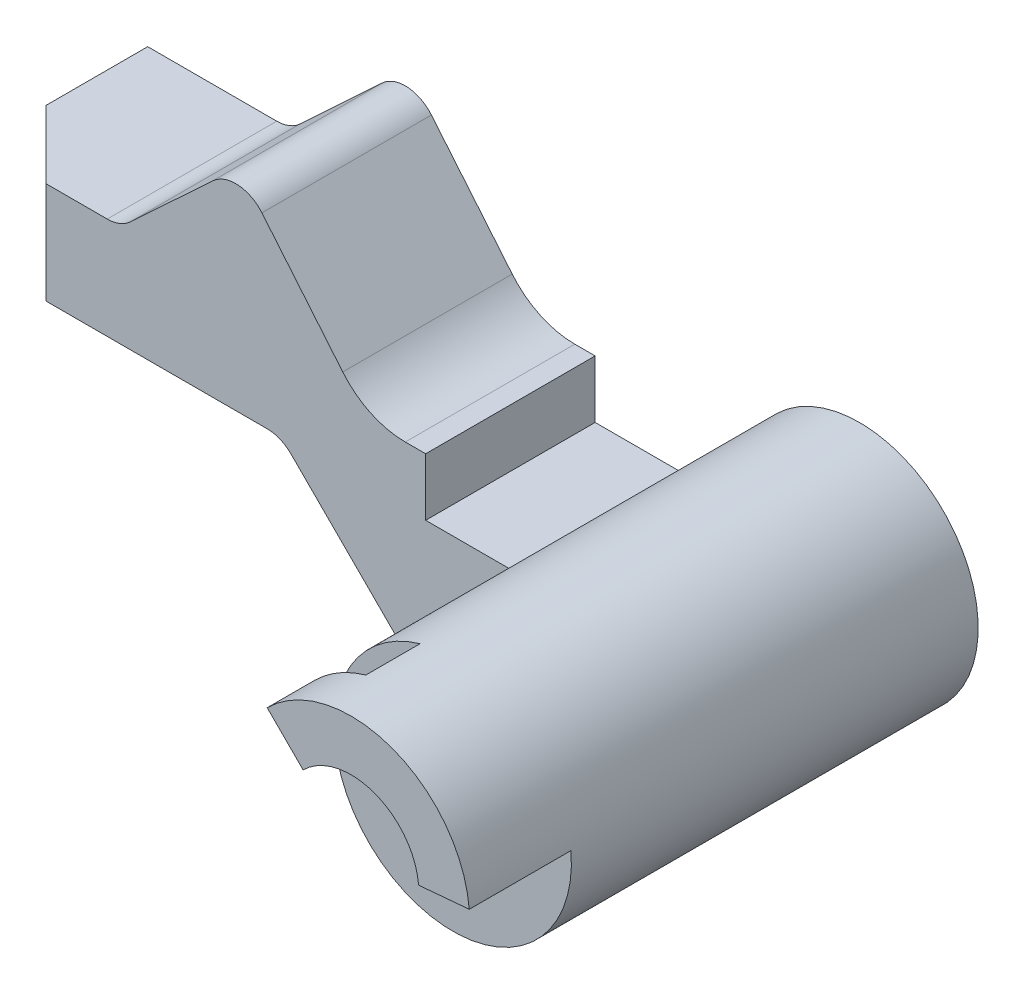
ISO-10303-21;
HEADER;
FILE_DESCRIPTION(('STEP AP214'),'2;1');
FILE_NAME('part.step','',(''),(''),'','','');
FILE_SCHEMA(('AUTOMOTIVE_DESIGN { 1 0 10303 214 1 1 1 1 }'));
ENDSEC;
DATA;
#1=APPLICATION_CONTEXT('core data for automotive mechanical design processes');
#2=APPLICATION_PROTOCOL_DEFINITION('international standard','automotive_design',2000,#1);
#3=PRODUCT_CONTEXT('',#1,'mechanical');
#4=PRODUCT('Part','Part','',(#3));
#5=PRODUCT_RELATED_PRODUCT_CATEGORY('part','',(#4));
#6=PRODUCT_DEFINITION_FORMATION('','',#4);
#7=PRODUCT_DEFINITION_CONTEXT('part definition',#1,'design');
#8=PRODUCT_DEFINITION('design','',#6,#7);
#9=PRODUCT_DEFINITION_SHAPE('','',#8);
#10=(LENGTH_UNIT() NAMED_UNIT(*) SI_UNIT(.MILLI.,.METRE.));
#11=(NAMED_UNIT(*) PLANE_ANGLE_UNIT() SI_UNIT($,.RADIAN.));
#12=(NAMED_UNIT(*) SI_UNIT($,.STERADIAN.) SOLID_ANGLE_UNIT());
#13=UNCERTAINTY_MEASURE_WITH_UNIT(LENGTH_MEASURE(1.E-05),#10,'distance_accuracy_value','');
#14=(GEOMETRIC_REPRESENTATION_CONTEXT(3) GLOBAL_UNCERTAINTY_ASSIGNED_CONTEXT((#13)) GLOBAL_UNIT_ASSIGNED_CONTEXT((#10,
#11,#12)) REPRESENTATION_CONTEXT('',''));
#15=CARTESIAN_POINT('',(0.,0.,0.));
#16=DIRECTION('',(0.,0.,1.));
#17=DIRECTION('',(1.,0.,0.));
#18=AXIS2_PLACEMENT_3D('',#15,#16,#17);
#19=CARTESIAN_POINT('',(1.012,-1.012,5.2));
#20=DIRECTION('',(0.,0.,-1.));
#21=DIRECTION('',(-1.,0.,0.));
#22=AXIS2_PLACEMENT_3D('',#19,#20,#21);
#23=PLANE('',#22);
#24=CARTESIAN_POINT('',(0.,0.,5.2));
#25=DIRECTION('',(0.,0.,-1.));
#26=DIRECTION('',(-1.,0.,0.));
#27=AXIS2_PLACEMENT_3D('',#24,#25,#26);
#28=CIRCLE('',#27,1.);
#29=CARTESIAN_POINT('',(-1.,0.,5.2));
#30=VERTEX_POINT('',#29);
#31=EDGE_CURVE('E21',#30,#30,#28,.F.);
#32=ORIENTED_EDGE('',*,*,#31,.F.);
#33=EDGE_LOOP('',(#32));
#34=FACE_BOUND('',#33,.T.);
#35=ADVANCED_FACE('F17',(#34),#23,.T.);
#36=CARTESIAN_POINT('',(0.,0.,5.67));
#37=DIRECTION('',(0.,0.,-1.));
#38=DIRECTION('',(-1.,0.,0.));
#39=AXIS2_PLACEMENT_3D('',#36,#37,#38);
#40=CYLINDRICAL_SURFACE('',#39,1.);
#41=CARTESIAN_POINT('',(0.,0.,0.5));
#42=DIRECTION('',(0.,0.,-1.));
#43=DIRECTION('',(-1.,0.,0.));
#44=AXIS2_PLACEMENT_3D('',#41,#42,#43);
#45=CIRCLE('',#44,1.);
#46=CARTESIAN_POINT('',(-1.,0.,0.5));
#47=VERTEX_POINT('',#46);
#48=EDGE_CURVE('E183',#47,#47,#45,.F.);
#49=ORIENTED_EDGE('',*,*,#48,.F.);
#50=EDGE_LOOP('',(#49));
#51=FACE_BOUND('',#50,.T.);
#52=ORIENTED_EDGE('',*,*,#31,.T.);
#53=EDGE_LOOP('',(#52));
#54=FACE_BOUND('',#53,.T.);
#55=ADVANCED_FACE('F194',(#51,#54),#40,.F.);
#56=CARTESIAN_POINT('',(0.,0.,7.65));
#57=DIRECTION('',(0.,0.,-1.));
#58=DIRECTION('',(-1.,0.,0.));
#59=AXIS2_PLACEMENT_3D('',#56,#57,#58);
#60=CYLINDRICAL_SURFACE('',#59,1.);
#61=CARTESIAN_POINT('',(0.,0.,6.8));
#62=DIRECTION('',(0.,0.,-1.));
#63=DIRECTION('',(-1.,0.,0.));
#64=AXIS2_PLACEMENT_3D('',#61,#62,#63);
#65=CIRCLE('',#64,1.);
#66=CARTESIAN_POINT('',(-0.275637355816253,0.961261695938534,6.8));
#67=VERTEX_POINT('',#66);
#68=CARTESIAN_POINT('',(-0.707106781186682,0.707106781186415,6.8));
#69=VERTEX_POINT('',#68);
#70=EDGE_CURVE('E138',#67,#69,#65,.F.);
#71=ORIENTED_EDGE('',*,*,#70,.F.);
#72=CARTESIAN_POINT('',(-0.275637355817,0.961261695938319,6.));
#73=CARTESIAN_POINT('',(-0.275637355817,0.961261695938319,6.8));
#74=B_SPLINE_CURVE_WITH_KNOTS('',1,(#72,#73),.UNSPECIFIED.,.F.,.F.,(2,2),(0.,1.),.UNSPECIFIED.);
#75=CARTESIAN_POINT('',(-0.275637355817,0.961261695938319,6.));
#76=VERTEX_POINT('',#75);
#77=EDGE_CURVE('E135',#76,#67,#74,.T.);
#78=ORIENTED_EDGE('',*,*,#77,.F.);
#79=CARTESIAN_POINT('',(0.,0.,6.));
#80=DIRECTION('',(0.,0.,-1.));
#81=DIRECTION('',(-1.,0.,0.));
#82=AXIS2_PLACEMENT_3D('',#79,#80,#81);
#83=CIRCLE('',#82,1.);
#84=CARTESIAN_POINT('',(0.996194698091745,0.0871557427476585,6.));
#85=VERTEX_POINT('',#84);
#86=EDGE_CURVE('E168',#85,#76,#83,.F.);
#87=ORIENTED_EDGE('',*,*,#86,.F.);
#88=CARTESIAN_POINT('',(0.996194698091746,0.0871557427476583,6.));
#89=CARTESIAN_POINT('',(0.996194698091746,0.0871557427476583,7.5));
#90=B_SPLINE_CURVE_WITH_KNOTS('',1,(#88,#89),.UNSPECIFIED.,.F.,.F.,(2,2),(0.,1.),.UNSPECIFIED.);
#91=CARTESIAN_POINT('',(0.996194698091745,0.0871557427476582,7.5));
#92=VERTEX_POINT('',#91);
#93=EDGE_CURVE('E178',#92,#85,#90,.F.);
#94=ORIENTED_EDGE('',*,*,#93,.F.);
#95=CARTESIAN_POINT('',(0.,0.,7.5));
#96=DIRECTION('',(0.,0.,-1.));
#97=DIRECTION('',(-1.,0.,0.));
#98=AXIS2_PLACEMENT_3D('',#95,#96,#97);
#99=CIRCLE('',#98,1.);
#100=CARTESIAN_POINT('',(-0.707106781186549,0.707106781186548,7.5));
#101=VERTEX_POINT('',#100);
#102=EDGE_CURVE('E175',#101,#92,#99,.T.);
#103=ORIENTED_EDGE('',*,*,#102,.F.);
#104=CARTESIAN_POINT('',(-0.707106781186548,0.707106781186547,6.8));
#105=CARTESIAN_POINT('',(-0.707106781186548,0.707106781186547,7.5));
#106=B_SPLINE_CURVE_WITH_KNOTS('',1,(#104,#105),.UNSPECIFIED.,.F.,.F.,(2,2),(0.,1.),.UNSPECIFIED.);
#107=EDGE_CURVE('E182',#69,#101,#106,.T.);
#108=ORIENTED_EDGE('',*,*,#107,.F.);
#109=EDGE_LOOP('',(#71,#78,#87,#94,#103,#108));
#110=FACE_BOUND('',#109,.T.);
#111=ADVANCED_FACE('F202',(#110),#60,.F.);
#112=CARTESIAN_POINT('',(0.,0.,-0.05));
#113=DIRECTION('',(0.,0.,-1.));
#114=DIRECTION('',(-1.,0.,0.));
#115=AXIS2_PLACEMENT_3D('',#112,#113,#114);
#116=CONICAL_SURFACE('',#115,1.55,0.785398163397448);
#117=CARTESIAN_POINT('',(0.,0.,0.));
#118=DIRECTION('',(0.,0.,-1.));
#119=DIRECTION('',(-1.,0.,0.));
#120=AXIS2_PLACEMENT_3D('',#117,#118,#119);
#121=CIRCLE('',#120,1.5);
#122=CARTESIAN_POINT('',(-1.5,0.,0.));
#123=VERTEX_POINT('',#122);
#124=EDGE_CURVE('E162',#123,#123,#121,.F.);
#125=ORIENTED_EDGE('',*,*,#124,.F.);
#126=EDGE_LOOP('',(#125));
#127=FACE_BOUND('',#126,.T.);
#128=ORIENTED_EDGE('',*,*,#48,.T.);
#129=EDGE_LOOP('',(#128));
#130=FACE_BOUND('',#129,.T.);
#131=ADVANCED_FACE('F759',(#127,#130),#116,.F.);
#132=CARTESIAN_POINT('',(-3.4,0.3,0.5));
#133=DIRECTION('',(1.,0.,0.));
#134=DIRECTION('',(0.,1.,0.));
#135=AXIS2_PLACEMENT_3D('',#132,#133,#134);
#136=PLANE('',#135);
#137=CARTESIAN_POINT('',(-3.4,0.3,0.5));
#138=CARTESIAN_POINT('',(-3.4,1.15,0.5));
#139=B_SPLINE_CURVE_WITH_KNOTS('',1,(#137,#138),.UNSPECIFIED.,.F.,.F.,(2,2),(0.,1.),.UNSPECIFIED.);
#140=CARTESIAN_POINT('',(-3.4,0.3,0.5));
#141=VERTEX_POINT('',#140);
#142=CARTESIAN_POINT('',(-3.4,1.15,0.5));
#143=VERTEX_POINT('',#142);
#144=EDGE_CURVE('E189',#141,#143,#139,.T.);
#145=ORIENTED_EDGE('',*,*,#144,.T.);
#146=CARTESIAN_POINT('',(-3.4,1.15,3.));
#147=CARTESIAN_POINT('',(-3.4,1.15,0.5));
#148=B_SPLINE_CURVE_WITH_KNOTS('',1,(#146,#147),.UNSPECIFIED.,.F.,.F.,(2,2),(0.,1.),.UNSPECIFIED.);
#149=CARTESIAN_POINT('',(-3.4,1.15,3.));
#150=VERTEX_POINT('',#149);
#151=EDGE_CURVE('E474',#150,#143,#148,.T.);
#152=ORIENTED_EDGE('',*,*,#151,.F.);
#153=CARTESIAN_POINT('',(-3.4,0.3,3.));
#154=CARTESIAN_POINT('',(-3.4,1.15,3.));
#155=B_SPLINE_CURVE_WITH_KNOTS('',1,(#153,#154),.UNSPECIFIED.,.F.,.F.,(2,2),(0.,1.),.UNSPECIFIED.);
#156=CARTESIAN_POINT('',(-3.4,0.3,3.));
#157=VERTEX_POINT('',#156);
#158=EDGE_CURVE('E185',#150,#157,#155,.F.);
#159=ORIENTED_EDGE('',*,*,#158,.T.);
#160=CARTESIAN_POINT('',(-3.4,0.3,0.5));
#161=CARTESIAN_POINT('',(-3.4,0.3,3.));
#162=B_SPLINE_CURVE_WITH_KNOTS('',1,(#160,#161),.UNSPECIFIED.,.F.,.F.,(2,2),(0.,1.),.UNSPECIFIED.);
#163=EDGE_CURVE('E333',#141,#157,#162,.T.);
#164=ORIENTED_EDGE('',*,*,#163,.F.);
#165=EDGE_LOOP('',(#145,#152,#159,#164));
#166=FACE_BOUND('',#165,.T.);
#167=ADVANCED_FACE('F533',(#166),#136,.T.);
#168=CARTESIAN_POINT('',(-3.3254833995939,-1.19999999999999,3.25));
#169=DIRECTION('',(0.,0.,-1.));
#170=DIRECTION('',(-1.,0.,0.));
#171=AXIS2_PLACEMENT_3D('',#168,#169,#170);
#172=CYLINDRICAL_SURFACE('',#171,0.500000000000009);
#173=CARTESIAN_POINT('',(-3.3254833995939,-1.19999999999999,0.5));
#174=DIRECTION('',(0.,0.,-1.));
#175=DIRECTION('',(-1.,0.,0.));
#176=AXIS2_PLACEMENT_3D('',#173,#174,#175);
#177=CIRCLE('',#176,0.500000000000009);
#178=CARTESIAN_POINT('',(-3.3254833995939,-1.70000000000004,0.5));
#179=VERTEX_POINT('',#178);
#180=CARTESIAN_POINT('',(-3.67903679018718,-1.55355339059327,0.5));
#181=VERTEX_POINT('',#180);
#182=EDGE_CURVE('E296',#179,#181,#177,.T.);
#183=ORIENTED_EDGE('',*,*,#182,.F.);
#184=CARTESIAN_POINT('',(-3.3254833995939,-1.7,0.5));
#185=CARTESIAN_POINT('',(-3.3254833995939,-1.7,3.));
#186=B_SPLINE_CURVE_WITH_KNOTS('',1,(#184,#185),.UNSPECIFIED.,.F.,.F.,(2,2),(0.,1.),.UNSPECIFIED.);
#187=CARTESIAN_POINT('',(-3.3254833995939,-1.7,3.));
#188=VERTEX_POINT('',#187);
#189=EDGE_CURVE('E158',#188,#179,#186,.F.);
#190=ORIENTED_EDGE('',*,*,#189,.F.);
#191=CARTESIAN_POINT('',(-3.3254833995939,-1.19999999999999,3.));
#192=DIRECTION('',(0.,0.,1.));
#193=DIRECTION('',(1.,0.,0.));
#194=AXIS2_PLACEMENT_3D('',#191,#192,#193);
#195=CIRCLE('',#194,0.500000000000009);
#196=CARTESIAN_POINT('',(-3.67903679018718,-1.55355339059327,3.));
#197=VERTEX_POINT('',#196);
#198=EDGE_CURVE('E248',#197,#188,#195,.T.);
#199=ORIENTED_EDGE('',*,*,#198,.F.);
#200=CARTESIAN_POINT('',(-3.67903679018718,-1.55355339059327,0.5));
#201=CARTESIAN_POINT('',(-3.67903679018718,-1.55355339059327,3.));
#202=B_SPLINE_CURVE_WITH_KNOTS('',1,(#200,#201),.UNSPECIFIED.,.F.,.F.,(2,2),(0.,1.),.UNSPECIFIED.);
#203=EDGE_CURVE('E251',#181,#197,#202,.T.);
#204=ORIENTED_EDGE('',*,*,#203,.F.);
#205=EDGE_LOOP('',(#183,#190,#199,#204));
#206=FACE_BOUND('',#205,.T.);
#207=ADVANCED_FACE('F250',(#206),#172,.T.);
#208=CARTESIAN_POINT('',(-3.4,0.3,0.5));
#209=DIRECTION('',(0.,1.,0.));
#210=DIRECTION('',(0.,0.,1.));
#211=AXIS2_PLACEMENT_3D('',#208,#209,#210);
#212=PLANE('',#211);
#213=ORIENTED_EDGE('',*,*,#163,.T.);
#214=CARTESIAN_POINT('',(-3.4,0.3,3.));
#215=CARTESIAN_POINT('',(-1.72409396495667,0.3,3.));
#216=B_SPLINE_CURVE_WITH_KNOTS('',1,(#214,#215),.UNSPECIFIED.,.F.,.F.,(2,2),(0.,1.),.UNSPECIFIED.);
#217=CARTESIAN_POINT('',(-1.72409396495667,0.299999999999986,3.));
#218=VERTEX_POINT('',#217);
#219=EDGE_CURVE('E336',#157,#218,#216,.T.);
#220=ORIENTED_EDGE('',*,*,#219,.T.);
#221=DIRECTION('',(0.,0.,-1.));
#222=VECTOR('',#221,1.);
#223=CARTESIAN_POINT('',(-1.72409396495667,0.299999999999971,8.25));
#224=LINE('',#223,#222);
#225=CARTESIAN_POINT('',(-1.72409396495667,0.299999999999986,0.5));
#226=VERTEX_POINT('',#225);
#227=EDGE_CURVE('E155',#226,#218,#224,.F.);
#228=ORIENTED_EDGE('',*,*,#227,.F.);
#229=CARTESIAN_POINT('',(-3.4,0.3,0.5));
#230=CARTESIAN_POINT('',(-1.72409396495667,0.3,0.5));
#231=B_SPLINE_CURVE_WITH_KNOTS('',1,(#229,#230),.UNSPECIFIED.,.F.,.F.,(2,2),(0.,1.),.UNSPECIFIED.);
#232=EDGE_CURVE('E505',#226,#141,#231,.F.);
#233=ORIENTED_EDGE('',*,*,#232,.T.);
#234=EDGE_LOOP('',(#213,#220,#228,#233));
#235=FACE_BOUND('',#234,.T.);
#236=ADVANCED_FACE('F549',(#235),#212,.T.);
#237=CARTESIAN_POINT('',(-0.482365372679749,1.68220796789206,6.));
#238=DIRECTION('',(-0.961261695938319,-0.275637355816998,0.));
#239=DIRECTION('',(0.275637355816998,-0.961261695938319,0.));
#240=AXIS2_PLACEMENT_3D('',#237,#238,#239);
#241=PLANE('',#240);
#242=DIRECTION('',(-0.275637355816999,0.961261695938319,0.));
#243=VECTOR('',#242,1.);
#244=CARTESIAN_POINT('',(-0.275637355817,0.961261695938319,6.));
#245=LINE('',#244,#243);
#246=CARTESIAN_POINT('',(-0.482365372679749,1.68220796789206,6.));
#247=VERTEX_POINT('',#246);
#248=EDGE_CURVE('E166',#76,#247,#245,.T.);
#249=ORIENTED_EDGE('',*,*,#248,.F.);
#250=ORIENTED_EDGE('',*,*,#77,.T.);
#251=DIRECTION('',(0.275637355816997,-0.96126169593832,0.));
#252=VECTOR('',#251,1.);
#253=CARTESIAN_POINT('',(-0.482365372679747,1.68220796789206,6.8));
#254=LINE('',#253,#252);
#255=CARTESIAN_POINT('',(-0.482365372679748,1.68220796789206,6.8));
#256=VERTEX_POINT('',#255);
#257=EDGE_CURVE('E129',#256,#67,#254,.T.);
#258=ORIENTED_EDGE('',*,*,#257,.F.);
#259=DIRECTION('',(0.,0.,-1.));
#260=VECTOR('',#259,1.);
#261=CARTESIAN_POINT('',(-0.482365372679749,1.68220796789206,8.25));
#262=LINE('',#261,#260);
#263=EDGE_CURVE('E134',#247,#256,#262,.F.);
#264=ORIENTED_EDGE('',*,*,#263,.F.);
#265=EDGE_LOOP('',(#249,#250,#258,#264));
#266=FACE_BOUND('',#265,.T.);
#267=ADVANCED_FACE('F132',(#266),#241,.T.);
#268=CARTESIAN_POINT('',(-1.24320766414403,0.701256174065772,6.8));
#269=DIRECTION('',(0.,0.,-1.));
#270=DIRECTION('',(0.,1.,0.));
#271=AXIS2_PLACEMENT_3D('',#268,#269,#270);
#272=PLANE('',#271);
#273=CARTESIAN_POINT('',(-1.23743686707646,1.23743686707646,6.8));
#274=CARTESIAN_POINT('',(-0.707106781186548,0.707106781186547,6.8));
#275=B_SPLINE_CURVE_WITH_KNOTS('',1,(#273,#274),.UNSPECIFIED.,.F.,.F.,(2,2),(0.,1.),.UNSPECIFIED.);
#276=CARTESIAN_POINT('',(-1.23743686707646,1.23743686707646,6.8));
#277=VERTEX_POINT('',#276);
#278=EDGE_CURVE('E144',#277,#69,#275,.T.);
#279=ORIENTED_EDGE('',*,*,#278,.F.);
#280=CARTESIAN_POINT('',(0.,0.,6.8));
#281=DIRECTION('',(0.,0.,-1.));
#282=DIRECTION('',(-1.,0.,0.));
#283=AXIS2_PLACEMENT_3D('',#280,#281,#282);
#284=CIRCLE('',#283,1.75);
#285=EDGE_CURVE('E141',#256,#277,#284,.F.);
#286=ORIENTED_EDGE('',*,*,#285,.F.);
#287=ORIENTED_EDGE('',*,*,#257,.T.);
#288=ORIENTED_EDGE('',*,*,#70,.T.);
#289=EDGE_LOOP('',(#279,#286,#287,#288));
#290=FACE_BOUND('',#289,.T.);
#291=ADVANCED_FACE('F142',(#290),#272,.T.);
#292=CARTESIAN_POINT('',(-1.23743686707646,1.23743686707646,6.8));
#293=DIRECTION('',(-0.707106781186548,-0.707106781186547,0.));
#294=DIRECTION('',(0.707106781186547,-0.707106781186548,0.));
#295=AXIS2_PLACEMENT_3D('',#292,#293,#294);
#296=PLANE('',#295);
#297=ORIENTED_EDGE('',*,*,#278,.T.);
#298=ORIENTED_EDGE('',*,*,#107,.T.);
#299=DIRECTION('',(0.707106781186549,-0.707106781186546,0.));
#300=VECTOR('',#299,1.);
#301=CARTESIAN_POINT('',(-1.23743686707646,1.23743686707646,7.5));
#302=LINE('',#301,#300);
#303=CARTESIAN_POINT('',(-1.23743686707646,1.23743686707646,7.5));
#304=VERTEX_POINT('',#303);
#305=EDGE_CURVE('E179',#304,#101,#302,.T.);
#306=ORIENTED_EDGE('',*,*,#305,.F.);
#307=DIRECTION('',(0.,0.,-1.));
#308=VECTOR('',#307,1.);
#309=CARTESIAN_POINT('',(-1.23743686707646,1.23743686707646,8.25));
#310=LINE('',#309,#308);
#311=EDGE_CURVE('E148',#277,#304,#310,.F.);
#312=ORIENTED_EDGE('',*,*,#311,.F.);
#313=EDGE_LOOP('',(#297,#298,#306,#312));
#314=FACE_BOUND('',#313,.T.);
#315=ADVANCED_FACE('F318',(#314),#296,.T.);
#316=CARTESIAN_POINT('',(1.76122538719298,0.0771786772041443,7.5));
#317=DIRECTION('',(0.,0.,1.));
#318=DIRECTION('',(0.,1.,0.));
#319=AXIS2_PLACEMENT_3D('',#316,#317,#318);
#320=PLANE('',#319);
#321=ORIENTED_EDGE('',*,*,#102,.T.);
#322=CARTESIAN_POINT('',(0.996194698091746,0.0871557427476583,7.5));
#323=CARTESIAN_POINT('',(1.74334072166055,0.152522549808402,7.5));
#324=B_SPLINE_CURVE_WITH_KNOTS('',1,(#322,#323),.UNSPECIFIED.,.F.,.F.,(2,2),(0.,1.),.UNSPECIFIED.);
#325=CARTESIAN_POINT('',(1.74334072166055,0.152522549808402,7.5));
#326=VERTEX_POINT('',#325);
#327=EDGE_CURVE('E174',#326,#92,#324,.F.);
#328=ORIENTED_EDGE('',*,*,#327,.F.);
#329=CARTESIAN_POINT('',(0.,0.,7.5));
#330=DIRECTION('',(0.,0.,-1.));
#331=DIRECTION('',(-1.,0.,0.));
#332=AXIS2_PLACEMENT_3D('',#329,#330,#331);
#333=CIRCLE('',#332,1.75);
#334=EDGE_CURVE('E314',#304,#326,#333,.T.);
#335=ORIENTED_EDGE('',*,*,#334,.F.);
#336=ORIENTED_EDGE('',*,*,#305,.T.);
#337=EDGE_LOOP('',(#321,#328,#335,#336));
#338=FACE_BOUND('',#337,.T.);
#339=ADVANCED_FACE('F321',(#338),#320,.T.);
#340=CARTESIAN_POINT('',(0.996194698091746,0.0871557427476583,6.));
#341=DIRECTION('',(0.0871557427476588,-0.996194698091745,0.));
#342=DIRECTION('',(0.996194698091745,0.0871557427476588,0.));
#343=AXIS2_PLACEMENT_3D('',#340,#341,#342);
#344=PLANE('',#343);
#345=DIRECTION('',(-0.996194698091746,-0.0871557427476595,0.));
#346=VECTOR('',#345,1.);
#347=CARTESIAN_POINT('',(1.74334072166055,0.152522549808403,6.));
#348=LINE('',#347,#346);
#349=CARTESIAN_POINT('',(1.74334072166056,0.152522549808403,6.));
#350=VERTEX_POINT('',#349);
#351=EDGE_CURVE('E171',#350,#85,#348,.T.);
#352=ORIENTED_EDGE('',*,*,#351,.F.);
#353=DIRECTION('',(0.,0.,-1.));
#354=VECTOR('',#353,1.);
#355=CARTESIAN_POINT('',(1.74334072166056,0.152522549808403,8.25));
#356=LINE('',#355,#354);
#357=EDGE_CURVE('E312',#326,#350,#356,.T.);
#358=ORIENTED_EDGE('',*,*,#357,.F.);
#359=ORIENTED_EDGE('',*,*,#327,.T.);
#360=ORIENTED_EDGE('',*,*,#93,.T.);
#361=EDGE_LOOP('',(#352,#358,#359,#360));
#362=FACE_BOUND('',#361,.T.);
#363=ADVANCED_FACE('F327',(#362),#344,.T.);
#364=CARTESIAN_POINT('',(1.80642,-1.80532719244242,6.));
#365=DIRECTION('',(0.,0.,1.));
#366=DIRECTION('',(0.,1.,0.));
#367=AXIS2_PLACEMENT_3D('',#364,#365,#366);
#368=PLANE('',#367);
#369=ORIENTED_EDGE('',*,*,#86,.T.);
#370=ORIENTED_EDGE('',*,*,#248,.T.);
#371=CARTESIAN_POINT('',(0.,0.,6.));
#372=DIRECTION('',(0.,0.,-1.));
#373=DIRECTION('',(-1.,0.,0.));
#374=AXIS2_PLACEMENT_3D('',#371,#372,#373);
#375=CIRCLE('',#374,1.75);
#376=EDGE_CURVE('E153',#350,#247,#375,.T.);
#377=ORIENTED_EDGE('',*,*,#376,.F.);
#378=ORIENTED_EDGE('',*,*,#351,.T.);
#379=EDGE_LOOP('',(#369,#370,#377,#378));
#380=FACE_BOUND('',#379,.T.);
#381=ADVANCED_FACE('F330',(#380),#368,.T.);
#382=CARTESIAN_POINT('',(1.771,-1.771,0.));
#383=DIRECTION('',(0.,0.,-1.));
#384=DIRECTION('',(-1.,0.,0.));
#385=AXIS2_PLACEMENT_3D('',#382,#383,#384);
#386=PLANE('',#385);
#387=ORIENTED_EDGE('',*,*,#124,.T.);
#388=EDGE_LOOP('',(#387));
#389=FACE_BOUND('',#388,.T.);
#390=CARTESIAN_POINT('',(0.,0.,0.));
#391=DIRECTION('',(0.,0.,-1.));
#392=DIRECTION('',(-1.,0.,0.));
#393=AXIS2_PLACEMENT_3D('',#390,#391,#392);
#394=CIRCLE('',#393,1.75);
#395=CARTESIAN_POINT('',(-1.75,0.,0.));
#396=VERTEX_POINT('',#395);
#397=EDGE_CURVE('E304',#396,#396,#394,.F.);
#398=ORIENTED_EDGE('',*,*,#397,.F.);
#399=EDGE_LOOP('',(#398));
#400=FACE_BOUND('',#399,.T.);
#401=ADVANCED_FACE('F686',(#389,#400),#386,.T.);
#402=CARTESIAN_POINT('',(-5.739696961967,-0.199999999999975,0.25));
#403=DIRECTION('',(0.,0.,1.));
#404=DIRECTION('',(1.,0.,0.));
#405=AXIS2_PLACEMENT_3D('',#402,#403,#404);
#406=CYLINDRICAL_SURFACE('',#405,0.499999999999977);
#407=CARTESIAN_POINT('',(-5.739696961967,-0.199999999999975,0.5));
#408=DIRECTION('',(0.,0.,-1.));
#409=DIRECTION('',(-1.,0.,0.));
#410=AXIS2_PLACEMENT_3D('',#407,#408,#409);
#411=CIRCLE('',#410,0.499999999999977);
#412=CARTESIAN_POINT('',(-5.38614357120451,0.153553390424055,0.5));
#413=VERTEX_POINT('',#412);
#414=CARTESIAN_POINT('',(-5.739696961967,0.300000000000002,0.5));
#415=VERTEX_POINT('',#414);
#416=EDGE_CURVE('E291',#413,#415,#411,.F.);
#417=ORIENTED_EDGE('',*,*,#416,.F.);
#418=CARTESIAN_POINT('',(-5.38614357137373,0.153553390593274,0.5));
#419=CARTESIAN_POINT('',(-5.38614357137373,0.153553390593274,3.));
#420=B_SPLINE_CURVE_WITH_KNOTS('',1,(#418,#419),.UNSPECIFIED.,.F.,.F.,(2,2),(0.,1.),.UNSPECIFIED.);
#421=CARTESIAN_POINT('',(-5.38614357137374,0.15355339059328,3.));
#422=VERTEX_POINT('',#421);
#423=EDGE_CURVE('E269',#422,#413,#420,.F.);
#424=ORIENTED_EDGE('',*,*,#423,.F.);
#425=CARTESIAN_POINT('',(-5.739696961967,-0.199999999999975,3.));
#426=DIRECTION('',(0.,0.,1.));
#427=DIRECTION('',(1.,0.,0.));
#428=AXIS2_PLACEMENT_3D('',#425,#426,#427);
#429=CIRCLE('',#428,0.499999999999977);
#430=CARTESIAN_POINT('',(-5.739696961967,0.3,3.));
#431=VERTEX_POINT('',#430);
#432=EDGE_CURVE('E272',#431,#422,#429,.F.);
#433=ORIENTED_EDGE('',*,*,#432,.F.);
#434=DIRECTION('',(0.,0.,-1.));
#435=VECTOR('',#434,1.);
#436=CARTESIAN_POINT('',(-5.739696961967,0.3,1.75));
#437=LINE('',#436,#435);
#438=EDGE_CURVE('E303',#415,#431,#437,.F.);
#439=ORIENTED_EDGE('',*,*,#438,.F.);
#440=EDGE_LOOP('',(#417,#424,#433,#439));
#441=FACE_BOUND('',#440,.T.);
#442=ADVANCED_FACE('F677',(#441),#406,.F.);
#443=CARTESIAN_POINT('',(-8.09677195262585,2.29999999999999,0.25));
#444=DIRECTION('',(0.,0.,1.));
#445=DIRECTION('',(1.,0.,0.));
#446=AXIS2_PLACEMENT_3D('',#443,#444,#445);
#447=CYLINDRICAL_SURFACE('',#446,0.499999999999996);
#448=CARTESIAN_POINT('',(-8.09677195262585,2.29999999999999,0.5));
#449=DIRECTION('',(0.,0.,-1.));
#450=DIRECTION('',(-1.,0.,0.));
#451=AXIS2_PLACEMENT_3D('',#448,#449,#450);
#452=CIRCLE('',#451,0.499999999999996);
#453=CARTESIAN_POINT('',(-8.09677195262585,1.8,0.5));
#454=VERTEX_POINT('',#453);
#455=CARTESIAN_POINT('',(-7.75600495182982,1.93410677627417,0.5));
#456=VERTEX_POINT('',#455);
#457=EDGE_CURVE('E287',#454,#456,#452,.F.);
#458=ORIENTED_EDGE('',*,*,#457,.F.);
#459=DIRECTION('',(0.,0.,1.));
#460=VECTOR('',#459,1.);
#461=CARTESIAN_POINT('',(-8.09677195262585,1.8,1.75));
#462=LINE('',#461,#460);
#463=CARTESIAN_POINT('',(-8.09677195262585,1.8,3.));
#464=VERTEX_POINT('',#463);
#465=EDGE_CURVE('E378',#464,#454,#462,.F.);
#466=ORIENTED_EDGE('',*,*,#465,.F.);
#467=CARTESIAN_POINT('',(-8.09677195262585,2.29999999999999,3.));
#468=DIRECTION('',(0.,0.,1.));
#469=DIRECTION('',(1.,0.,0.));
#470=AXIS2_PLACEMENT_3D('',#467,#468,#469);
#471=CIRCLE('',#470,0.499999999999996);
#472=CARTESIAN_POINT('',(-7.75600495113397,1.93410677692224,3.));
#473=VERTEX_POINT('',#472);
#474=EDGE_CURVE('E399',#473,#464,#471,.F.);
#475=ORIENTED_EDGE('',*,*,#474,.F.);
#476=CARTESIAN_POINT('',(-7.75600495182982,1.93410677627417,0.5));
#477=CARTESIAN_POINT('',(-7.75600495182982,1.93410677627417,3.));
#478=B_SPLINE_CURVE_WITH_KNOTS('',1,(#476,#477),.UNSPECIFIED.,.F.,.F.,(2,2),(0.,1.),.UNSPECIFIED.);
#479=EDGE_CURVE('E408',#456,#473,#478,.T.);
#480=ORIENTED_EDGE('',*,*,#479,.F.);
#481=EDGE_LOOP('',(#458,#466,#475,#480));
#482=FACE_BOUND('',#481,.T.);
#483=ADVANCED_FACE('F668',(#482),#447,.F.);
#484=CARTESIAN_POINT('',(-10.,0.3,0.5));
#485=DIRECTION('',(-1.,0.,0.));
#486=DIRECTION('',(0.,0.,1.));
#487=AXIS2_PLACEMENT_3D('',#484,#485,#486);
#488=PLANE('',#487);
#489=DIRECTION('',(0.,0.,1.));
#490=VECTOR('',#489,1.);
#491=CARTESIAN_POINT('',(-10.,0.3,1.75));
#492=LINE('',#491,#490);
#493=CARTESIAN_POINT('',(-10.,0.3,2.));
#494=VERTEX_POINT('',#493);
#495=CARTESIAN_POINT('',(-10.,0.300000000000001,0.5));
#496=VERTEX_POINT('',#495);
#497=EDGE_CURVE('E302',#494,#496,#492,.F.);
#498=ORIENTED_EDGE('',*,*,#497,.F.);
#499=CARTESIAN_POINT('',(-10.,0.3,2.));
#500=CARTESIAN_POINT('',(-10.,1.8,2.));
#501=B_SPLINE_CURVE_WITH_KNOTS('',1,(#499,#500),.UNSPECIFIED.,.F.,.F.,(2,2),(0.,1.),.UNSPECIFIED.);
#502=CARTESIAN_POINT('',(-10.,1.8,2.));
#503=VERTEX_POINT('',#502);
#504=EDGE_CURVE('E307',#503,#494,#501,.F.);
#505=ORIENTED_EDGE('',*,*,#504,.F.);
#506=DIRECTION('',(0.,0.,-1.));
#507=VECTOR('',#506,1.);
#508=CARTESIAN_POINT('',(-10.,1.8,1.75));
#509=LINE('',#508,#507);
#510=CARTESIAN_POINT('',(-10.,1.8,0.5));
#511=VERTEX_POINT('',#510);
#512=EDGE_CURVE('E384',#511,#503,#509,.F.);
#513=ORIENTED_EDGE('',*,*,#512,.F.);
#514=DIRECTION('',(0.,1.,0.));
#515=VECTOR('',#514,1.);
#516=CARTESIAN_POINT('',(-10.,0.789346999999965,0.5));
#517=LINE('',#516,#515);
#518=EDGE_CURVE('E394',#496,#511,#517,.T.);
#519=ORIENTED_EDGE('',*,*,#518,.F.);
#520=EDGE_LOOP('',(#498,#505,#513,#519));
#521=FACE_BOUND('',#520,.T.);
#522=ADVANCED_FACE('F659',(#521),#488,.T.);
#523=CARTESIAN_POINT('',(-10.,1.8,0.5));
#524=DIRECTION('',(0.,1.,0.));
#525=DIRECTION('',(0.,0.,1.));
#526=AXIS2_PLACEMENT_3D('',#523,#524,#525);
#527=PLANE('',#526);
#528=ORIENTED_EDGE('',*,*,#512,.T.);
#529=DIRECTION('',(-0.707106781186547,0.,-0.707106781186548));
#530=VECTOR('',#529,1.);
#531=CARTESIAN_POINT('',(-9.5,1.8,2.5));
#532=LINE('',#531,#530);
#533=CARTESIAN_POINT('',(-9.,1.8,3.));
#534=VERTEX_POINT('',#533);
#535=EDGE_CURVE('E370',#534,#503,#532,.T.);
#536=ORIENTED_EDGE('',*,*,#535,.F.);
#537=DIRECTION('',(-1.,0.,0.));
#538=VECTOR('',#537,1.);
#539=CARTESIAN_POINT('',(-9.04838597631293,1.8,3.));
#540=LINE('',#539,#538);
#541=EDGE_CURVE('E165',#534,#464,#540,.F.);
#542=ORIENTED_EDGE('',*,*,#541,.T.);
#543=ORIENTED_EDGE('',*,*,#465,.T.);
#544=DIRECTION('',(1.,0.,0.));
#545=VECTOR('',#544,1.);
#546=CARTESIAN_POINT('',(-5.17891159015224,1.8,0.5));
#547=LINE('',#546,#545);
#548=EDGE_CURVE('E290',#511,#454,#547,.T.);
#549=ORIENTED_EDGE('',*,*,#548,.F.);
#550=EDGE_LOOP('',(#528,#536,#542,#543,#549));
#551=FACE_BOUND('',#550,.T.);
#552=ADVANCED_FACE('F652',(#551),#527,.T.);
#553=CARTESIAN_POINT('',(-3.7,1.15,3.));
#554=DIRECTION('',(0.,1.,0.));
#555=DIRECTION('',(1.,0.,0.));
#556=AXIS2_PLACEMENT_3D('',#553,#554,#555);
#557=PLANE('',#556);
#558=CARTESIAN_POINT('',(-3.7,1.15,3.));
#559=CARTESIAN_POINT('',(-3.4,1.15,3.));
#560=B_SPLINE_CURVE_WITH_KNOTS('',1,(#558,#559),.UNSPECIFIED.,.F.,.F.,(2,2),(0.,1.),.UNSPECIFIED.);
#561=CARTESIAN_POINT('',(-3.7,1.15,3.));
#562=VERTEX_POINT('',#561);
#563=EDGE_CURVE('E377',#562,#150,#560,.T.);
#564=ORIENTED_EDGE('',*,*,#563,.T.);
#565=ORIENTED_EDGE('',*,*,#151,.T.);
#566=DIRECTION('',(1.,0.,0.));
#567=VECTOR('',#566,1.);
#568=CARTESIAN_POINT('',(-5.17891159015224,1.15,0.5));
#569=LINE('',#568,#567);
#570=CARTESIAN_POINT('',(-3.7,1.15,0.5));
#571=VERTEX_POINT('',#570);
#572=EDGE_CURVE('E284',#571,#143,#569,.T.);
#573=ORIENTED_EDGE('',*,*,#572,.F.);
#574=DIRECTION('',(0.,0.,1.));
#575=VECTOR('',#574,1.);
#576=CARTESIAN_POINT('',(-3.7,1.15,1.75));
#577=LINE('',#576,#575);
#578=EDGE_CURVE('E273',#562,#571,#577,.F.);
#579=ORIENTED_EDGE('',*,*,#578,.F.);
#580=EDGE_LOOP('',(#564,#565,#573,#579));
#581=FACE_BOUND('',#580,.T.);
#582=ADVANCED_FACE('F539',(#581),#557,.T.);
#583=CARTESIAN_POINT('',(-3.67903679018718,-1.55355339059327,0.5));
#584=DIRECTION('',(-0.707106781186546,-0.707106781186549,0.));
#585=DIRECTION('',(0.,0.,1.));
#586=AXIS2_PLACEMENT_3D('',#583,#584,#585);
#587=PLANE('',#586);
#588=ORIENTED_EDGE('',*,*,#203,.T.);
#589=DIRECTION('',(0.707106781186548,-0.707106781186547,0.));
#590=VECTOR('',#589,1.);
#591=CARTESIAN_POINT('',(-5.38614357137373,0.153553390593272,3.));
#592=LINE('',#591,#590);
#593=EDGE_CURVE('E259',#422,#197,#592,.T.);
#594=ORIENTED_EDGE('',*,*,#593,.F.);
#595=ORIENTED_EDGE('',*,*,#423,.T.);
#596=DIRECTION('',(-0.707106781186546,0.707106781186549,0.));
#597=VECTOR('',#596,1.);
#598=CARTESIAN_POINT('',(-3.67903679018718,-1.55355339059327,0.5));
#599=LINE('',#598,#597);
#600=EDGE_CURVE('E267',#181,#413,#599,.T.);
#601=ORIENTED_EDGE('',*,*,#600,.F.);
#602=EDGE_LOOP('',(#588,#594,#595,#601));
#603=FACE_BOUND('',#602,.T.);
#604=ADVANCED_FACE('F263',(#603),#587,.T.);
#605=CARTESIAN_POINT('',(-3.3254833995939,-1.7,0.5));
#606=DIRECTION('',(0.,-1.,0.));
#607=DIRECTION('',(1.,0.,0.));
#608=AXIS2_PLACEMENT_3D('',#605,#606,#607);
#609=PLANE('',#608);
#610=DIRECTION('',(-1.,0.,0.));
#611=VECTOR('',#610,1.);
#612=CARTESIAN_POINT('',(-5.17891159015224,-1.70000000000007,0.5));
#613=LINE('',#612,#611);
#614=CARTESIAN_POINT('',(-0.415331193145619,-1.70000000000007,0.5));
#615=VERTEX_POINT('',#614);
#616=EDGE_CURVE('E298',#615,#179,#613,.T.);
#617=ORIENTED_EDGE('',*,*,#616,.F.);
#618=DIRECTION('',(0.,0.,-1.));
#619=VECTOR('',#618,1.);
#620=CARTESIAN_POINT('',(-0.415331193145619,-1.70000000000007,8.25));
#621=LINE('',#620,#619);
#622=CARTESIAN_POINT('',(-0.415331193145762,-1.70000000000004,3.));
#623=VERTEX_POINT('',#622);
#624=EDGE_CURVE('E308',#623,#615,#621,.T.);
#625=ORIENTED_EDGE('',*,*,#624,.F.);
#626=DIRECTION('',(-1.,0.,0.));
#627=VECTOR('',#626,1.);
#628=CARTESIAN_POINT('',(-4.68191159015239,-1.7,3.));
#629=LINE('',#628,#627);
#630=EDGE_CURVE('E258',#188,#623,#629,.F.);
#631=ORIENTED_EDGE('',*,*,#630,.F.);
#632=ORIENTED_EDGE('',*,*,#189,.T.);
#633=EDGE_LOOP('',(#617,#625,#631,#632));
#634=FACE_BOUND('',#633,.T.);
#635=ADVANCED_FACE('F555',(#634),#609,.T.);
#636=CARTESIAN_POINT('',(0.,0.,8.25));
#637=DIRECTION('',(0.,0.,-1.));
#638=DIRECTION('',(-1.,0.,0.));
#639=AXIS2_PLACEMENT_3D('',#636,#637,#638);
#640=CYLINDRICAL_SURFACE('',#639,1.75);
#641=ORIENTED_EDGE('',*,*,#376,.T.);
#642=ORIENTED_EDGE('',*,*,#263,.T.);
#643=ORIENTED_EDGE('',*,*,#285,.T.);
#644=ORIENTED_EDGE('',*,*,#311,.T.);
#645=ORIENTED_EDGE('',*,*,#334,.T.);
#646=ORIENTED_EDGE('',*,*,#357,.T.);
#647=EDGE_LOOP('',(#641,#642,#643,#644,#645,#646));
#648=FACE_BOUND('',#647,.T.);
#649=ORIENTED_EDGE('',*,*,#397,.T.);
#650=EDGE_LOOP('',(#649));
#651=FACE_BOUND('',#650,.T.);
#652=CARTESIAN_POINT('',(0.,0.,0.5));
#653=DIRECTION('',(0.,0.,-1.));
#654=DIRECTION('',(-1.,0.,0.));
#655=AXIS2_PLACEMENT_3D('',#652,#653,#654);
#656=CIRCLE('',#655,1.75);
#657=EDGE_CURVE('E281',#226,#615,#656,.F.);
#658=ORIENTED_EDGE('',*,*,#657,.F.);
#659=ORIENTED_EDGE('',*,*,#227,.T.);
#660=CARTESIAN_POINT('',(0.,0.,3.));
#661=DIRECTION('',(0.,0.,-1.));
#662=DIRECTION('',(-1.,0.,0.));
#663=AXIS2_PLACEMENT_3D('',#660,#661,#662);
#664=CIRCLE('',#663,1.75);
#665=EDGE_CURVE('E421',#623,#218,#664,.T.);
#666=ORIENTED_EDGE('',*,*,#665,.F.);
#667=ORIENTED_EDGE('',*,*,#624,.T.);
#668=EDGE_LOOP('',(#658,#659,#666,#667));
#669=FACE_BOUND('',#668,.T.);
#670=ADVANCED_FACE('F150',(#648,#651,#669),#640,.T.);
#671=CARTESIAN_POINT('',(-9.,0.3,3.));
#672=DIRECTION('',(-0.707106781186548,0.,0.707106781186547));
#673=DIRECTION('',(0.,1.,0.));
#674=AXIS2_PLACEMENT_3D('',#671,#672,#673);
#675=PLANE('',#674);
#676=DIRECTION('',(0.,1.,0.));
#677=VECTOR('',#676,1.);
#678=CARTESIAN_POINT('',(-9.,0.789347,3.));
#679=LINE('',#678,#677);
#680=CARTESIAN_POINT('',(-9.,0.3,3.));
#681=VERTEX_POINT('',#680);
#682=EDGE_CURVE('E373',#534,#681,#679,.F.);
#683=ORIENTED_EDGE('',*,*,#682,.F.);
#684=ORIENTED_EDGE('',*,*,#535,.T.);
#685=ORIENTED_EDGE('',*,*,#504,.T.);
#686=DIRECTION('',(-0.707106781186547,0.,-0.707106781186548));
#687=VECTOR('',#686,1.);
#688=CARTESIAN_POINT('',(-9.,0.3,3.));
#689=LINE('',#688,#687);
#690=EDGE_CURVE('E299',#681,#494,#689,.T.);
#691=ORIENTED_EDGE('',*,*,#690,.F.);
#692=EDGE_LOOP('',(#683,#684,#685,#691));
#693=FACE_BOUND('',#692,.T.);
#694=ADVANCED_FACE('F562',(#693),#675,.T.);
#695=CARTESIAN_POINT('',(-5.739696961967,0.3,0.5));
#696=DIRECTION('',(0.,-1.,0.));
#697=DIRECTION('',(0.,0.,1.));
#698=AXIS2_PLACEMENT_3D('',#695,#696,#697);
#699=PLANE('',#698);
#700=ORIENTED_EDGE('',*,*,#690,.T.);
#701=ORIENTED_EDGE('',*,*,#497,.T.);
#702=DIRECTION('',(-1.,0.,0.));
#703=VECTOR('',#702,1.);
#704=CARTESIAN_POINT('',(-5.17891159015224,0.300000000000003,0.5));
#705=LINE('',#704,#703);
#706=EDGE_CURVE('E294',#415,#496,#705,.T.);
#707=ORIENTED_EDGE('',*,*,#706,.F.);
#708=ORIENTED_EDGE('',*,*,#438,.T.);
#709=DIRECTION('',(-1.,0.,0.));
#710=VECTOR('',#709,1.);
#711=CARTESIAN_POINT('',(-4.68191159015239,0.3,3.));
#712=LINE('',#711,#710);
#713=EDGE_CURVE('E371',#681,#431,#712,.F.);
#714=ORIENTED_EDGE('',*,*,#713,.F.);
#715=EDGE_LOOP('',(#700,#701,#707,#708,#714));
#716=FACE_BOUND('',#715,.T.);
#717=ADVANCED_FACE('F569',(#716),#699,.T.);
#718=CARTESIAN_POINT('',(-7.75600495182982,1.93410677627417,0.5));
#719=DIRECTION('',(-0.681534001592052,0.731786447451662,0.));
#720=DIRECTION('',(0.,0.,1.));
#721=AXIS2_PLACEMENT_3D('',#718,#719,#720);
#722=PLANE('',#721);
#723=ORIENTED_EDGE('',*,*,#479,.T.);
#724=DIRECTION('',(-0.731786447451662,-0.681534001592053,0.));
#725=VECTOR('',#724,1.);
#726=CARTESIAN_POINT('',(-6.54076700079713,3.06589322372481,3.));
#727=LINE('',#726,#725);
#728=CARTESIAN_POINT('',(-6.54076700079657,3.06589322372532,3.));
#729=VERTEX_POINT('',#728);
#730=EDGE_CURVE('E416',#729,#473,#727,.T.);
#731=ORIENTED_EDGE('',*,*,#730,.F.);
#732=DIRECTION('',(0.,0.,1.));
#733=VECTOR('',#732,1.);
#734=CARTESIAN_POINT('',(-6.54076700079712,3.06589322372481,1.75));
#735=LINE('',#734,#733);
#736=CARTESIAN_POINT('',(-6.54076700079657,3.06589322372532,0.5));
#737=VERTEX_POINT('',#736);
#738=EDGE_CURVE('E412',#737,#729,#735,.T.);
#739=ORIENTED_EDGE('',*,*,#738,.F.);
#740=DIRECTION('',(0.731786447451662,0.681534001592053,0.));
#741=VECTOR('',#740,1.);
#742=CARTESIAN_POINT('',(-7.75600495182982,1.93410677627417,0.5));
#743=LINE('',#742,#741);
#744=EDGE_CURVE('E285',#456,#737,#743,.T.);
#745=ORIENTED_EDGE('',*,*,#744,.F.);
#746=EDGE_LOOP('',(#723,#731,#739,#745));
#747=FACE_BOUND('',#746,.T.);
#748=ADVANCED_FACE('F573',(#747),#722,.T.);
#749=CARTESIAN_POINT('',(-0.357823180304475,-1.70000000000007,0.5));
#750=DIRECTION('',(0.,0.,-1.));
#751=DIRECTION('',(-1.,0.,0.));
#752=AXIS2_PLACEMENT_3D('',#749,#750,#751);
#753=PLANE('',#752);
#754=ORIENTED_EDGE('',*,*,#232,.F.);
#755=ORIENTED_EDGE('',*,*,#657,.T.);
#756=ORIENTED_EDGE('',*,*,#616,.T.);
#757=ORIENTED_EDGE('',*,*,#182,.T.);
#758=ORIENTED_EDGE('',*,*,#600,.T.);
#759=ORIENTED_EDGE('',*,*,#416,.T.);
#760=ORIENTED_EDGE('',*,*,#706,.T.);
#761=ORIENTED_EDGE('',*,*,#518,.T.);
#762=ORIENTED_EDGE('',*,*,#548,.T.);
#763=ORIENTED_EDGE('',*,*,#457,.T.);
#764=ORIENTED_EDGE('',*,*,#744,.T.);
#765=CARTESIAN_POINT('',(-6.2,2.70000000000001,0.499999999999999));
#766=DIRECTION('',(0.,0.,-1.));
#767=DIRECTION('',(0.,1.,0.));
#768=AXIS2_PLACEMENT_3D('',#765,#766,#767);
#769=CIRCLE('',#768,0.499999999999997);
#770=CARTESIAN_POINT('',(-5.81528826863647,3.01936950973954,0.5));
#771=VERTEX_POINT('',#770);
#772=EDGE_CURVE('E221',#771,#737,#769,.F.);
#773=ORIENTED_EDGE('',*,*,#772,.F.);
#774=CARTESIAN_POINT('',(-5.81528826863647,3.01936950973954,0.5));
#775=CARTESIAN_POINT('',(-4.62330815527104,1.58351317662337,0.5));
#776=B_SPLINE_CURVE_WITH_KNOTS('',1,(#774,#775),.UNSPECIFIED.,.F.,.F.,(2,2),(0.,1.),.UNSPECIFIED.);
#777=CARTESIAN_POINT('',(-4.62330815527104,1.58351317662337,0.5));
#778=VERTEX_POINT('',#777);
#779=EDGE_CURVE('E36',#778,#771,#776,.F.);
#780=ORIENTED_EDGE('',*,*,#779,.F.);
#781=CARTESIAN_POINT('',(-3.7,2.34999999999999,0.5));
#782=DIRECTION('',(0.,0.,-1.));
#783=DIRECTION('',(-1.,0.,0.));
#784=AXIS2_PLACEMENT_3D('',#781,#782,#783);
#785=CIRCLE('',#784,1.2);
#786=EDGE_CURVE('E276',#571,#778,#785,.T.);
#787=ORIENTED_EDGE('',*,*,#786,.F.);
#788=ORIENTED_EDGE('',*,*,#572,.T.);
#789=ORIENTED_EDGE('',*,*,#144,.F.);
#790=EDGE_LOOP('',(#754,#755,#756,#757,#758,#759,#760,#761,#762,#763,#764,#773,#780,#787,#788,#789));
#791=FACE_BOUND('',#790,.T.);
#792=ADVANCED_FACE('F541',(#791),#753,.T.);
#793=CARTESIAN_POINT('',(-3.7,2.34999999999999,3.25));
#794=DIRECTION('',(0.,0.,-1.));
#795=DIRECTION('',(-1.,0.,0.));
#796=AXIS2_PLACEMENT_3D('',#793,#794,#795);
#797=CYLINDRICAL_SURFACE('',#796,1.2);
#798=CARTESIAN_POINT('',(-3.7,2.34999999999999,3.));
#799=DIRECTION('',(0.,0.,-1.));
#800=DIRECTION('',(-1.,0.,0.));
#801=AXIS2_PLACEMENT_3D('',#798,#799,#800);
#802=CIRCLE('',#801,1.2);
#803=CARTESIAN_POINT('',(-4.62330815527104,1.58351317662337,3.));
#804=VERTEX_POINT('',#803);
#805=EDGE_CURVE('E419',#562,#804,#802,.T.);
#806=ORIENTED_EDGE('',*,*,#805,.F.);
#807=ORIENTED_EDGE('',*,*,#578,.T.);
#808=ORIENTED_EDGE('',*,*,#786,.T.);
#809=CARTESIAN_POINT('',(-4.62330815527104,1.58351317662337,0.5));
#810=CARTESIAN_POINT('',(-4.62330815527104,1.58351317662337,3.));
#811=B_SPLINE_CURVE_WITH_KNOTS('',1,(#809,#810),.UNSPECIFIED.,.F.,.F.,(2,2),(0.,1.),.UNSPECIFIED.);
#812=EDGE_CURVE('E428',#804,#778,#811,.F.);
#813=ORIENTED_EDGE('',*,*,#812,.F.);
#814=EDGE_LOOP('',(#806,#807,#808,#813));
#815=FACE_BOUND('',#814,.T.);
#816=ADVANCED_FACE('F544',(#815),#797,.F.);
#817=CARTESIAN_POINT('',(-0.36382318030478,-1.7,3.));
#818=DIRECTION('',(0.,0.,1.));
#819=DIRECTION('',(0.,1.,0.));
#820=AXIS2_PLACEMENT_3D('',#817,#818,#819);
#821=PLANE('',#820);
#822=ORIENTED_EDGE('',*,*,#713,.T.);
#823=ORIENTED_EDGE('',*,*,#432,.T.);
#824=ORIENTED_EDGE('',*,*,#593,.T.);
#825=ORIENTED_EDGE('',*,*,#198,.T.);
#826=ORIENTED_EDGE('',*,*,#630,.T.);
#827=ORIENTED_EDGE('',*,*,#665,.T.);
#828=ORIENTED_EDGE('',*,*,#219,.F.);
#829=ORIENTED_EDGE('',*,*,#158,.F.);
#830=ORIENTED_EDGE('',*,*,#563,.F.);
#831=ORIENTED_EDGE('',*,*,#805,.T.);
#832=CARTESIAN_POINT('',(-5.81528826863647,3.01936950973954,3.));
#833=CARTESIAN_POINT('',(-4.62330815527104,1.58351317662337,3.));
#834=B_SPLINE_CURVE_WITH_KNOTS('',1,(#832,#833),.UNSPECIFIED.,.F.,.F.,(2,2),(0.,1.),.UNSPECIFIED.);
#835=CARTESIAN_POINT('',(-5.81528826863647,3.01936950973954,3.));
#836=VERTEX_POINT('',#835);
#837=EDGE_CURVE('E27',#836,#804,#834,.T.);
#838=ORIENTED_EDGE('',*,*,#837,.F.);
#839=CARTESIAN_POINT('',(-6.2,2.7,3.));
#840=DIRECTION('',(0.,0.,-1.));
#841=DIRECTION('',(0.,1.,0.));
#842=AXIS2_PLACEMENT_3D('',#839,#840,#841);
#843=CIRCLE('',#842,0.499999999999997);
#844=EDGE_CURVE('E224',#729,#836,#843,.T.);
#845=ORIENTED_EDGE('',*,*,#844,.F.);
#846=ORIENTED_EDGE('',*,*,#730,.T.);
#847=ORIENTED_EDGE('',*,*,#474,.T.);
#848=ORIENTED_EDGE('',*,*,#541,.F.);
#849=ORIENTED_EDGE('',*,*,#682,.T.);
#850=EDGE_LOOP('',(#822,#823,#824,#825,#826,#827,#828,#829,#830,#831,#838,#845,#846,#847,#848,#849));
#851=FACE_BOUND('',#850,.T.);
#852=ADVANCED_FACE('F211',(#851),#821,.T.);
#853=CARTESIAN_POINT('',(-6.2,2.7,3.25));
#854=DIRECTION('',(0.,0.,-1.));
#855=DIRECTION('',(0.,1.,0.));
#856=AXIS2_PLACEMENT_3D('',#853,#854,#855);
#857=CYLINDRICAL_SURFACE('',#856,0.499999999999997);
#858=ORIENTED_EDGE('',*,*,#844,.T.);
#859=CARTESIAN_POINT('',(-5.81528826863647,3.01936950973954,0.5));
#860=CARTESIAN_POINT('',(-5.81528826863647,3.01936950973954,3.));
#861=B_SPLINE_CURVE_WITH_KNOTS('',1,(#859,#860),.UNSPECIFIED.,.F.,.F.,(2,2),(0.,1.),.UNSPECIFIED.);
#862=EDGE_CURVE('E11',#771,#836,#861,.T.);
#863=ORIENTED_EDGE('',*,*,#862,.F.);
#864=ORIENTED_EDGE('',*,*,#772,.T.);
#865=ORIENTED_EDGE('',*,*,#738,.T.);
#866=EDGE_LOOP('',(#858,#863,#864,#865));
#867=FACE_BOUND('',#866,.T.);
#868=ADVANCED_FACE('F206',(#867),#857,.T.);
#869=CARTESIAN_POINT('',(-5.81528826863647,3.01936950973954,0.5));
#870=DIRECTION('',(0.769423462727071,0.63873901947907,0.));
#871=DIRECTION('',(0.,0.,1.));
#872=AXIS2_PLACEMENT_3D('',#869,#870,#871);
#873=PLANE('',#872);
#874=ORIENTED_EDGE('',*,*,#862,.T.);
#875=ORIENTED_EDGE('',*,*,#837,.T.);
#876=ORIENTED_EDGE('',*,*,#812,.T.);
#877=ORIENTED_EDGE('',*,*,#779,.T.);
#878=EDGE_LOOP('',(#874,#875,#876,#877));
#879=FACE_BOUND('',#878,.T.);
#880=ADVANCED_FACE('F19',(#879),#873,.T.);
#881=CLOSED_SHELL('',(#35,#55,#111,#131,#167,#207,#236,#267,#291,#315,#339,#363,#381,#401,#442,
#483,#522,#552,#582,#604,#635,#670,#694,#717,#748,#792,#816,#852,#868,#880));
#882=MANIFOLD_SOLID_BREP('B1',#881);
#883=ADVANCED_BREP_SHAPE_REPRESENTATION('',(#18,#882),#14);
#884=SHAPE_DEFINITION_REPRESENTATION(#9,#883);
ENDSEC;
END-ISO-10303-21;
